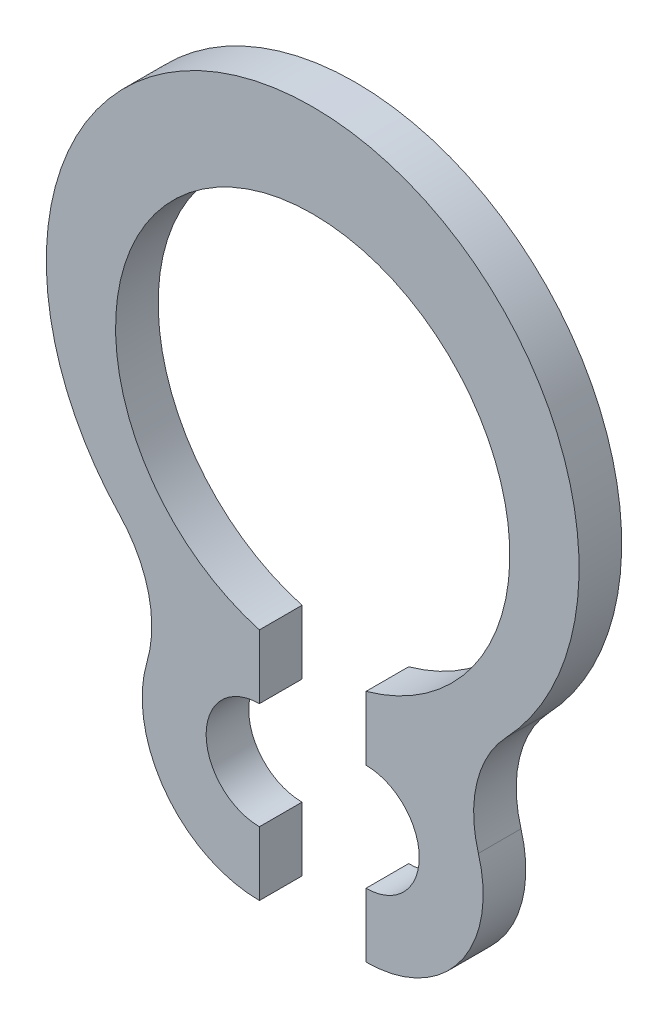
ISO-10303-21;
HEADER;
FILE_DESCRIPTION(('STEP AP214'),'2;1');
FILE_NAME('part.step','',(''),(''),'','','');
FILE_SCHEMA(('AUTOMOTIVE_DESIGN { 1 0 10303 214 1 1 1 1 }'));
ENDSEC;
DATA;
#1=APPLICATION_CONTEXT('core data for automotive mechanical design processes');
#2=APPLICATION_PROTOCOL_DEFINITION('international standard','automotive_design',2000,#1);
#3=PRODUCT_CONTEXT('',#1,'mechanical');
#4=PRODUCT('Part','Part','',(#3));
#5=PRODUCT_RELATED_PRODUCT_CATEGORY('part','',(#4));
#6=PRODUCT_DEFINITION_FORMATION('','',#4);
#7=PRODUCT_DEFINITION_CONTEXT('part definition',#1,'design');
#8=PRODUCT_DEFINITION('design','',#6,#7);
#9=PRODUCT_DEFINITION_SHAPE('','',#8);
#10=(LENGTH_UNIT() NAMED_UNIT(*) SI_UNIT(.MILLI.,.METRE.));
#11=(NAMED_UNIT(*) PLANE_ANGLE_UNIT() SI_UNIT($,.RADIAN.));
#12=(NAMED_UNIT(*) SI_UNIT($,.STERADIAN.) SOLID_ANGLE_UNIT());
#13=UNCERTAINTY_MEASURE_WITH_UNIT(LENGTH_MEASURE(1.E-05),#10,'distance_accuracy_value','');
#14=(GEOMETRIC_REPRESENTATION_CONTEXT(3) GLOBAL_UNCERTAINTY_ASSIGNED_CONTEXT((#13)) GLOBAL_UNIT_ASSIGNED_CONTEXT((#10,
#11,#12)) REPRESENTATION_CONTEXT('',''));
#15=CARTESIAN_POINT('',(0.,0.,0.));
#16=DIRECTION('',(0.,0.,1.));
#17=DIRECTION('',(1.,0.,0.));
#18=AXIS2_PLACEMENT_3D('',#15,#16,#17);
#19=CARTESIAN_POINT('',(-0.5,-3.10115131305569,-0.4));
#20=DIRECTION('',(0.,0.,1.));
#21=DIRECTION('',(1.,0.,0.));
#22=AXIS2_PLACEMENT_3D('',#19,#20,#21);
#23=CYLINDRICAL_SURFACE('',#22,0.5);
#24=CARTESIAN_POINT('',(-0.5,-3.10115131305569,0.));
#25=DIRECTION('',(0.,0.,-1.));
#26=DIRECTION('',(1.,0.,0.));
#27=AXIS2_PLACEMENT_3D('',#24,#25,#26);
#28=CIRCLE('',#27,0.5);
#29=CARTESIAN_POINT('',(-0.499999999999999,-3.60115131305569,0.));
#30=VERTEX_POINT('',#29);
#31=CARTESIAN_POINT('',(-0.5,-2.60115131305569,0.));
#32=VERTEX_POINT('',#31);
#33=EDGE_CURVE('E194',#30,#32,#28,.T.);
#34=ORIENTED_EDGE('',*,*,#33,.F.);
#35=DIRECTION('',(0.,0.,1.));
#36=VECTOR('',#35,1.);
#37=CARTESIAN_POINT('',(-0.499999999999999,-3.60115131305569,-0.4));
#38=LINE('',#37,#36);
#39=CARTESIAN_POINT('',(-0.499999999999999,-3.60115131305569,-0.4));
#40=VERTEX_POINT('',#39);
#41=EDGE_CURVE('E11',#40,#30,#38,.T.);
#42=ORIENTED_EDGE('',*,*,#41,.F.);
#43=CARTESIAN_POINT('',(-0.5,-3.10115131305569,-0.4));
#44=DIRECTION('',(0.,0.,-1.));
#45=DIRECTION('',(1.,0.,0.));
#46=AXIS2_PLACEMENT_3D('',#43,#44,#45);
#47=CIRCLE('',#46,0.5);
#48=CARTESIAN_POINT('',(-0.5,-2.60115131305569,-0.4));
#49=VERTEX_POINT('',#48);
#50=EDGE_CURVE('E238',#40,#49,#47,.T.);
#51=ORIENTED_EDGE('',*,*,#50,.T.);
#52=DIRECTION('',(0.,0.,1.));
#53=VECTOR('',#52,1.);
#54=CARTESIAN_POINT('',(-0.5,-2.60115131305569,-0.4));
#55=LINE('',#54,#53);
#56=EDGE_CURVE('E44',#49,#32,#55,.T.);
#57=ORIENTED_EDGE('',*,*,#56,.T.);
#58=EDGE_LOOP('',(#34,#42,#51,#57));
#59=FACE_BOUND('',#58,.T.);
#60=ADVANCED_FACE('F41',(#59),#23,.F.);
#61=CARTESIAN_POINT('',(-0.499999999999999,-3.60115131305569,-0.4));
#62=DIRECTION('',(1.,0.,0.));
#63=DIRECTION('',(0.,1.,0.));
#64=AXIS2_PLACEMENT_3D('',#61,#62,#63);
#65=PLANE('',#64);
#66=DIRECTION('',(0.,1.,0.));
#67=VECTOR('',#66,1.);
#68=CARTESIAN_POINT('',(-0.499999999999999,-3.60115131305569,0.));
#69=LINE('',#68,#67);
#70=CARTESIAN_POINT('',(-0.499999999999999,-4.20115131305569,0.));
#71=VERTEX_POINT('',#70);
#72=EDGE_CURVE('E235',#71,#30,#69,.T.);
#73=ORIENTED_EDGE('',*,*,#72,.F.);
#74=DIRECTION('',(0.,0.,1.));
#75=VECTOR('',#74,1.);
#76=CARTESIAN_POINT('',(-0.499999999999999,-4.20115131305569,-0.4));
#77=LINE('',#76,#75);
#78=CARTESIAN_POINT('',(-0.499999999999999,-4.20115131305569,-0.4));
#79=VERTEX_POINT('',#78);
#80=EDGE_CURVE('E51',#79,#71,#77,.T.);
#81=ORIENTED_EDGE('',*,*,#80,.F.);
#82=DIRECTION('',(0.,1.,0.));
#83=VECTOR('',#82,1.);
#84=CARTESIAN_POINT('',(-0.499999999999999,-3.60115131305569,-0.4));
#85=LINE('',#84,#83);
#86=EDGE_CURVE('E178',#79,#40,#85,.T.);
#87=ORIENTED_EDGE('',*,*,#86,.T.);
#88=ORIENTED_EDGE('',*,*,#41,.T.);
#89=EDGE_LOOP('',(#73,#81,#87,#88));
#90=FACE_BOUND('',#89,.T.);
#91=ADVANCED_FACE('F269',(#90),#65,.T.);
#92=CARTESIAN_POINT('',(-0.5,-3.10115131305569,-0.4));
#93=DIRECTION('',(0.,0.,1.));
#94=DIRECTION('',(1.,0.,0.));
#95=AXIS2_PLACEMENT_3D('',#92,#93,#94);
#96=CYLINDRICAL_SURFACE('',#95,1.1);
#97=CARTESIAN_POINT('',(-0.5,-3.10115131305569,0.));
#98=DIRECTION('',(0.,0.,1.));
#99=DIRECTION('',(-1.,0.,0.));
#100=AXIS2_PLACEMENT_3D('',#97,#98,#99);
#101=CIRCLE('',#100,1.1);
#102=CARTESIAN_POINT('',(-1.55513062517609,-2.79018609986376,0.));
#103=VERTEX_POINT('',#102);
#104=EDGE_CURVE('E164',#103,#71,#101,.T.);
#105=ORIENTED_EDGE('',*,*,#104,.F.);
#106=DIRECTION('',(0.,0.,1.));
#107=VECTOR('',#106,1.);
#108=CARTESIAN_POINT('',(-1.55513062517609,-2.79018609986376,-0.4));
#109=LINE('',#108,#107);
#110=CARTESIAN_POINT('',(-1.55513062517609,-2.79018609986376,-0.4));
#111=VERTEX_POINT('',#110);
#112=EDGE_CURVE('E159',#111,#103,#109,.T.);
#113=ORIENTED_EDGE('',*,*,#112,.F.);
#114=CARTESIAN_POINT('',(-0.5,-3.10115131305569,-0.4));
#115=DIRECTION('',(0.,0.,1.));
#116=DIRECTION('',(-1.,0.,0.));
#117=AXIS2_PLACEMENT_3D('',#114,#115,#116);
#118=CIRCLE('',#117,1.1);
#119=EDGE_CURVE('E162',#111,#79,#118,.T.);
#120=ORIENTED_EDGE('',*,*,#119,.T.);
#121=ORIENTED_EDGE('',*,*,#80,.T.);
#122=EDGE_LOOP('',(#105,#113,#120,#121));
#123=FACE_BOUND('',#122,.T.);
#124=ADVANCED_FACE('F161',(#123),#96,.T.);
#125=CARTESIAN_POINT('',(-2.61026125035219,-2.47922088667182,-0.4));
#126=DIRECTION('',(0.,0.,1.));
#127=DIRECTION('',(1.,0.,0.));
#128=AXIS2_PLACEMENT_3D('',#125,#126,#127);
#129=CYLINDRICAL_SURFACE('',#128,1.1);
#130=CARTESIAN_POINT('',(-2.61026125035219,-2.47922088667182,0.));
#131=DIRECTION('',(0.,0.,-1.));
#132=DIRECTION('',(-1.,0.,0.));
#133=AXIS2_PLACEMENT_3D('',#130,#131,#132);
#134=CIRCLE('',#133,1.1);
#135=CARTESIAN_POINT('',(-1.81268142385569,-1.72168117129988,0.));
#136=VERTEX_POINT('',#135);
#137=EDGE_CURVE('E230',#136,#103,#134,.T.);
#138=ORIENTED_EDGE('',*,*,#137,.F.);
#139=DIRECTION('',(0.,0.,1.));
#140=VECTOR('',#139,1.);
#141=CARTESIAN_POINT('',(-1.81268142385569,-1.72168117129988,-0.4));
#142=LINE('',#141,#140);
#143=CARTESIAN_POINT('',(-1.81268142385569,-1.72168117129988,-0.4));
#144=VERTEX_POINT('',#143);
#145=EDGE_CURVE('E170',#144,#136,#142,.T.);
#146=ORIENTED_EDGE('',*,*,#145,.F.);
#147=CARTESIAN_POINT('',(-2.61026125035219,-2.47922088667182,-0.4));
#148=DIRECTION('',(0.,0.,-1.));
#149=DIRECTION('',(-1.,0.,0.));
#150=AXIS2_PLACEMENT_3D('',#147,#148,#149);
#151=CIRCLE('',#150,1.1);
#152=EDGE_CURVE('E176',#144,#111,#151,.T.);
#153=ORIENTED_EDGE('',*,*,#152,.T.);
#154=ORIENTED_EDGE('',*,*,#112,.T.);
#155=EDGE_LOOP('',(#138,#146,#153,#154));
#156=FACE_BOUND('',#155,.T.);
#157=ADVANCED_FACE('F181',(#156),#129,.F.);
#158=CARTESIAN_POINT('',(0.,0.,-0.4));
#159=DIRECTION('',(0.,0.,1.));
#160=DIRECTION('',(1.,0.,0.));
#161=AXIS2_PLACEMENT_3D('',#158,#159,#160);
#162=CYLINDRICAL_SURFACE('',#161,2.5);
#163=CARTESIAN_POINT('',(0.,0.,0.));
#164=DIRECTION('',(0.,0.,1.));
#165=DIRECTION('',(1.,0.,0.));
#166=AXIS2_PLACEMENT_3D('',#163,#164,#165);
#167=CIRCLE('',#166,2.5);
#168=CARTESIAN_POINT('',(1.81268142385569,-1.72168117129988,0.));
#169=VERTEX_POINT('',#168);
#170=EDGE_CURVE('E226',#169,#136,#167,.T.);
#171=ORIENTED_EDGE('',*,*,#170,.F.);
#172=DIRECTION('',(0.,0.,1.));
#173=VECTOR('',#172,1.);
#174=CARTESIAN_POINT('',(1.81268142385569,-1.72168117129988,-0.4));
#175=LINE('',#174,#173);
#176=CARTESIAN_POINT('',(1.81268142385569,-1.72168117129988,-0.4));
#177=VERTEX_POINT('',#176);
#178=EDGE_CURVE('E243',#177,#169,#175,.T.);
#179=ORIENTED_EDGE('',*,*,#178,.F.);
#180=CARTESIAN_POINT('',(0.,0.,-0.4));
#181=DIRECTION('',(0.,0.,1.));
#182=DIRECTION('',(1.,0.,0.));
#183=AXIS2_PLACEMENT_3D('',#180,#181,#182);
#184=CIRCLE('',#183,2.5);
#185=EDGE_CURVE('E183',#177,#144,#184,.T.);
#186=ORIENTED_EDGE('',*,*,#185,.T.);
#187=ORIENTED_EDGE('',*,*,#145,.T.);
#188=EDGE_LOOP('',(#171,#179,#186,#187));
#189=FACE_BOUND('',#188,.T.);
#190=ADVANCED_FACE('F282',(#189),#162,.T.);
#191=CARTESIAN_POINT('',(2.61026125035219,-2.47922088667182,-0.4));
#192=DIRECTION('',(0.,0.,1.));
#193=DIRECTION('',(1.,0.,0.));
#194=AXIS2_PLACEMENT_3D('',#191,#192,#193);
#195=CYLINDRICAL_SURFACE('',#194,1.1);
#196=CARTESIAN_POINT('',(2.61026125035219,-2.47922088667182,0.));
#197=DIRECTION('',(0.,0.,-1.));
#198=DIRECTION('',(1.,0.,0.));
#199=AXIS2_PLACEMENT_3D('',#196,#197,#198);
#200=CIRCLE('',#199,1.1);
#201=CARTESIAN_POINT('',(1.55513062517609,-2.79018609986376,0.));
#202=VERTEX_POINT('',#201);
#203=EDGE_CURVE('E222',#202,#169,#200,.T.);
#204=ORIENTED_EDGE('',*,*,#203,.F.);
#205=DIRECTION('',(0.,0.,1.));
#206=VECTOR('',#205,1.);
#207=CARTESIAN_POINT('',(1.55513062517609,-2.79018609986376,-0.4));
#208=LINE('',#207,#206);
#209=CARTESIAN_POINT('',(1.55513062517609,-2.79018609986376,-0.4));
#210=VERTEX_POINT('',#209);
#211=EDGE_CURVE('E246',#210,#202,#208,.T.);
#212=ORIENTED_EDGE('',*,*,#211,.F.);
#213=CARTESIAN_POINT('',(2.61026125035219,-2.47922088667182,-0.4));
#214=DIRECTION('',(0.,0.,-1.));
#215=DIRECTION('',(1.,0.,0.));
#216=AXIS2_PLACEMENT_3D('',#213,#214,#215);
#217=CIRCLE('',#216,1.1);
#218=EDGE_CURVE('E188',#210,#177,#217,.T.);
#219=ORIENTED_EDGE('',*,*,#218,.T.);
#220=ORIENTED_EDGE('',*,*,#178,.T.);
#221=EDGE_LOOP('',(#204,#212,#219,#220));
#222=FACE_BOUND('',#221,.T.);
#223=ADVANCED_FACE('F285',(#222),#195,.F.);
#224=CARTESIAN_POINT('',(0.5,-3.10115131305569,-0.4));
#225=DIRECTION('',(0.,0.,1.));
#226=DIRECTION('',(1.,0.,0.));
#227=AXIS2_PLACEMENT_3D('',#224,#225,#226);
#228=CYLINDRICAL_SURFACE('',#227,1.1);
#229=CARTESIAN_POINT('',(0.5,-3.10115131305569,0.));
#230=DIRECTION('',(0.,0.,1.));
#231=DIRECTION('',(1.,0.,0.));
#232=AXIS2_PLACEMENT_3D('',#229,#230,#231);
#233=CIRCLE('',#232,1.1);
#234=CARTESIAN_POINT('',(0.5,-4.20115131305569,0.));
#235=VERTEX_POINT('',#234);
#236=EDGE_CURVE('E218',#235,#202,#233,.T.);
#237=ORIENTED_EDGE('',*,*,#236,.F.);
#238=DIRECTION('',(0.,0.,1.));
#239=VECTOR('',#238,1.);
#240=CARTESIAN_POINT('',(0.5,-4.20115131305569,-0.4));
#241=LINE('',#240,#239);
#242=CARTESIAN_POINT('',(0.5,-4.20115131305569,-0.4));
#243=VERTEX_POINT('',#242);
#244=EDGE_CURVE('E249',#243,#235,#241,.T.);
#245=ORIENTED_EDGE('',*,*,#244,.F.);
#246=CARTESIAN_POINT('',(0.5,-3.10115131305569,-0.4));
#247=DIRECTION('',(0.,0.,1.));
#248=DIRECTION('',(1.,0.,0.));
#249=AXIS2_PLACEMENT_3D('',#246,#247,#248);
#250=CIRCLE('',#249,1.1);
#251=EDGE_CURVE('E415',#243,#210,#250,.T.);
#252=ORIENTED_EDGE('',*,*,#251,.T.);
#253=ORIENTED_EDGE('',*,*,#211,.T.);
#254=EDGE_LOOP('',(#237,#245,#252,#253));
#255=FACE_BOUND('',#254,.T.);
#256=ADVANCED_FACE('F289',(#255),#228,.T.);
#257=CARTESIAN_POINT('',(0.5,-3.60115131305569,-0.4));
#258=DIRECTION('',(-1.,0.,0.));
#259=DIRECTION('',(0.,-1.,0.));
#260=AXIS2_PLACEMENT_3D('',#257,#258,#259);
#261=PLANE('',#260);
#262=DIRECTION('',(0.,-1.,0.));
#263=VECTOR('',#262,1.);
#264=CARTESIAN_POINT('',(0.5,-3.60115131305569,0.));
#265=LINE('',#264,#263);
#266=CARTESIAN_POINT('',(0.5,-3.60115131305569,0.));
#267=VERTEX_POINT('',#266);
#268=EDGE_CURVE('E214',#267,#235,#265,.T.);
#269=ORIENTED_EDGE('',*,*,#268,.F.);
#270=DIRECTION('',(0.,0.,1.));
#271=VECTOR('',#270,1.);
#272=CARTESIAN_POINT('',(0.5,-3.60115131305569,-0.4));
#273=LINE('',#272,#271);
#274=CARTESIAN_POINT('',(0.5,-3.60115131305569,-0.4));
#275=VERTEX_POINT('',#274);
#276=EDGE_CURVE('E252',#275,#267,#273,.T.);
#277=ORIENTED_EDGE('',*,*,#276,.F.);
#278=DIRECTION('',(0.,-1.,0.));
#279=VECTOR('',#278,1.);
#280=CARTESIAN_POINT('',(0.5,-3.60115131305569,-0.4));
#281=LINE('',#280,#279);
#282=EDGE_CURVE('E422',#275,#243,#281,.T.);
#283=ORIENTED_EDGE('',*,*,#282,.T.);
#284=ORIENTED_EDGE('',*,*,#244,.T.);
#285=EDGE_LOOP('',(#269,#277,#283,#284));
#286=FACE_BOUND('',#285,.T.);
#287=ADVANCED_FACE('F293',(#286),#261,.T.);
#288=CARTESIAN_POINT('',(0.5,-3.10115131305569,-0.4));
#289=DIRECTION('',(0.,0.,1.));
#290=DIRECTION('',(1.,0.,0.));
#291=AXIS2_PLACEMENT_3D('',#288,#289,#290);
#292=CYLINDRICAL_SURFACE('',#291,0.5);
#293=CARTESIAN_POINT('',(0.5,-3.10115131305569,0.));
#294=DIRECTION('',(0.,0.,-1.));
#295=DIRECTION('',(-1.,0.,0.));
#296=AXIS2_PLACEMENT_3D('',#293,#294,#295);
#297=CIRCLE('',#296,0.5);
#298=CARTESIAN_POINT('',(0.5,-2.60115131305569,0.));
#299=VERTEX_POINT('',#298);
#300=EDGE_CURVE('E210',#299,#267,#297,.T.);
#301=ORIENTED_EDGE('',*,*,#300,.F.);
#302=DIRECTION('',(0.,0.,1.));
#303=VECTOR('',#302,1.);
#304=CARTESIAN_POINT('',(0.5,-2.60115131305569,-0.4));
#305=LINE('',#304,#303);
#306=CARTESIAN_POINT('',(0.5,-2.60115131305569,-0.4));
#307=VERTEX_POINT('',#306);
#308=EDGE_CURVE('E255',#307,#299,#305,.T.);
#309=ORIENTED_EDGE('',*,*,#308,.F.);
#310=CARTESIAN_POINT('',(0.5,-3.10115131305569,-0.4));
#311=DIRECTION('',(0.,0.,-1.));
#312=DIRECTION('',(-1.,0.,0.));
#313=AXIS2_PLACEMENT_3D('',#310,#311,#312);
#314=CIRCLE('',#313,0.5);
#315=EDGE_CURVE('E408',#307,#275,#314,.T.);
#316=ORIENTED_EDGE('',*,*,#315,.T.);
#317=ORIENTED_EDGE('',*,*,#276,.T.);
#318=EDGE_LOOP('',(#301,#309,#316,#317));
#319=FACE_BOUND('',#318,.T.);
#320=ADVANCED_FACE('F297',(#319),#292,.F.);
#321=CARTESIAN_POINT('',(0.5,-2.00115131305569,-0.4));
#322=DIRECTION('',(-1.,0.,0.));
#323=DIRECTION('',(0.,-1.,0.));
#324=AXIS2_PLACEMENT_3D('',#321,#322,#323);
#325=PLANE('',#324);
#326=DIRECTION('',(0.,-1.,0.));
#327=VECTOR('',#326,1.);
#328=CARTESIAN_POINT('',(0.5,-2.00115131305569,0.));
#329=LINE('',#328,#327);
#330=CARTESIAN_POINT('',(0.5,-2.00115131305569,0.));
#331=VERTEX_POINT('',#330);
#332=EDGE_CURVE('E206',#331,#299,#329,.T.);
#333=ORIENTED_EDGE('',*,*,#332,.F.);
#334=DIRECTION('',(0.,0.,1.));
#335=VECTOR('',#334,1.);
#336=CARTESIAN_POINT('',(0.5,-2.00115131305569,-0.4));
#337=LINE('',#336,#335);
#338=CARTESIAN_POINT('',(0.5,-2.00115131305569,-0.4));
#339=VERTEX_POINT('',#338);
#340=EDGE_CURVE('E258',#339,#331,#337,.T.);
#341=ORIENTED_EDGE('',*,*,#340,.F.);
#342=DIRECTION('',(0.,-1.,0.));
#343=VECTOR('',#342,1.);
#344=CARTESIAN_POINT('',(0.5,-2.00115131305569,-0.4));
#345=LINE('',#344,#343);
#346=EDGE_CURVE('E404',#339,#307,#345,.T.);
#347=ORIENTED_EDGE('',*,*,#346,.T.);
#348=ORIENTED_EDGE('',*,*,#308,.T.);
#349=EDGE_LOOP('',(#333,#341,#347,#348));
#350=FACE_BOUND('',#349,.T.);
#351=ADVANCED_FACE('F301',(#350),#325,.T.);
#352=CARTESIAN_POINT('',(0.,-0.22,-0.4));
#353=DIRECTION('',(0.,0.,1.));
#354=DIRECTION('',(1.,0.,0.));
#355=AXIS2_PLACEMENT_3D('',#352,#353,#354);
#356=CYLINDRICAL_SURFACE('',#355,1.85);
#357=CARTESIAN_POINT('',(0.,-0.22,0.));
#358=DIRECTION('',(0.,0.,-1.));
#359=DIRECTION('',(1.,0.,0.));
#360=AXIS2_PLACEMENT_3D('',#357,#358,#359);
#361=CIRCLE('',#360,1.85);
#362=CARTESIAN_POINT('',(-0.5,-2.00115131305569,0.));
#363=VERTEX_POINT('',#362);
#364=EDGE_CURVE('E202',#363,#331,#361,.T.);
#365=ORIENTED_EDGE('',*,*,#364,.F.);
#366=DIRECTION('',(0.,0.,1.));
#367=VECTOR('',#366,1.);
#368=CARTESIAN_POINT('',(-0.5,-2.00115131305569,-0.4));
#369=LINE('',#368,#367);
#370=CARTESIAN_POINT('',(-0.5,-2.00115131305569,-0.4));
#371=VERTEX_POINT('',#370);
#372=EDGE_CURVE('E260',#371,#363,#369,.T.);
#373=ORIENTED_EDGE('',*,*,#372,.F.);
#374=CARTESIAN_POINT('',(0.,-0.22,-0.4));
#375=DIRECTION('',(0.,0.,-1.));
#376=DIRECTION('',(1.,0.,0.));
#377=AXIS2_PLACEMENT_3D('',#374,#375,#376);
#378=CIRCLE('',#377,1.85);
#379=EDGE_CURVE('E429',#371,#339,#378,.T.);
#380=ORIENTED_EDGE('',*,*,#379,.T.);
#381=ORIENTED_EDGE('',*,*,#340,.T.);
#382=EDGE_LOOP('',(#365,#373,#380,#381));
#383=FACE_BOUND('',#382,.T.);
#384=ADVANCED_FACE('F305',(#383),#356,.F.);
#385=CARTESIAN_POINT('',(-0.5,-2.00115131305569,-0.4));
#386=DIRECTION('',(1.,0.,0.));
#387=DIRECTION('',(0.,1.,0.));
#388=AXIS2_PLACEMENT_3D('',#385,#386,#387);
#389=PLANE('',#388);
#390=DIRECTION('',(0.,1.,0.));
#391=VECTOR('',#390,1.);
#392=CARTESIAN_POINT('',(-0.5,-2.00115131305569,0.));
#393=LINE('',#392,#391);
#394=EDGE_CURVE('E198',#32,#363,#393,.T.);
#395=ORIENTED_EDGE('',*,*,#394,.F.);
#396=ORIENTED_EDGE('',*,*,#56,.F.);
#397=DIRECTION('',(0.,1.,0.));
#398=VECTOR('',#397,1.);
#399=CARTESIAN_POINT('',(-0.5,-2.00115131305569,-0.4));
#400=LINE('',#399,#398);
#401=EDGE_CURVE('E432',#49,#371,#400,.T.);
#402=ORIENTED_EDGE('',*,*,#401,.T.);
#403=ORIENTED_EDGE('',*,*,#372,.T.);
#404=EDGE_LOOP('',(#395,#396,#402,#403));
#405=FACE_BOUND('',#404,.T.);
#406=ADVANCED_FACE('F266',(#405),#389,.T.);
#407=CARTESIAN_POINT('',(-0.5,-3.10115131305569,-0.4));
#408=DIRECTION('',(0.,0.,1.));
#409=DIRECTION('',(1.,0.,0.));
#410=AXIS2_PLACEMENT_3D('',#407,#408,#409);
#411=PLANE('',#410);
#412=ORIENTED_EDGE('',*,*,#50,.F.);
#413=ORIENTED_EDGE('',*,*,#86,.F.);
#414=ORIENTED_EDGE('',*,*,#119,.F.);
#415=ORIENTED_EDGE('',*,*,#152,.F.);
#416=ORIENTED_EDGE('',*,*,#185,.F.);
#417=ORIENTED_EDGE('',*,*,#218,.F.);
#418=ORIENTED_EDGE('',*,*,#251,.F.);
#419=ORIENTED_EDGE('',*,*,#282,.F.);
#420=ORIENTED_EDGE('',*,*,#315,.F.);
#421=ORIENTED_EDGE('',*,*,#346,.F.);
#422=ORIENTED_EDGE('',*,*,#379,.F.);
#423=ORIENTED_EDGE('',*,*,#401,.F.);
#424=EDGE_LOOP('',(#412,#413,#414,#415,#416,#417,#418,#419,#420,#421,#422,#423));
#425=FACE_BOUND('',#424,.T.);
#426=ADVANCED_FACE('F174',(#425),#411,.F.);
#427=CARTESIAN_POINT('',(-0.5,-3.10115131305569,0.));
#428=DIRECTION('',(0.,0.,1.));
#429=DIRECTION('',(1.,0.,0.));
#430=AXIS2_PLACEMENT_3D('',#427,#428,#429);
#431=PLANE('',#430);
#432=ORIENTED_EDGE('',*,*,#33,.T.);
#433=ORIENTED_EDGE('',*,*,#394,.T.);
#434=ORIENTED_EDGE('',*,*,#364,.T.);
#435=ORIENTED_EDGE('',*,*,#332,.T.);
#436=ORIENTED_EDGE('',*,*,#300,.T.);
#437=ORIENTED_EDGE('',*,*,#268,.T.);
#438=ORIENTED_EDGE('',*,*,#236,.T.);
#439=ORIENTED_EDGE('',*,*,#203,.T.);
#440=ORIENTED_EDGE('',*,*,#170,.T.);
#441=ORIENTED_EDGE('',*,*,#137,.T.);
#442=ORIENTED_EDGE('',*,*,#104,.T.);
#443=ORIENTED_EDGE('',*,*,#72,.T.);
#444=EDGE_LOOP('',(#432,#433,#434,#435,#436,#437,#438,#439,#440,#441,#442,#443));
#445=FACE_BOUND('',#444,.T.);
#446=ADVANCED_FACE('F268',(#445),#431,.T.);
#447=CLOSED_SHELL('',(#60,#91,#124,#157,#190,#223,#256,#287,#320,#351,#384,#406,#426,#446));
#448=MANIFOLD_SOLID_BREP('B2',#447);
#449=ADVANCED_BREP_SHAPE_REPRESENTATION('',(#18,#448),#14);
#450=SHAPE_DEFINITION_REPRESENTATION(#9,#449);
ENDSEC;
END-ISO-10303-21;
